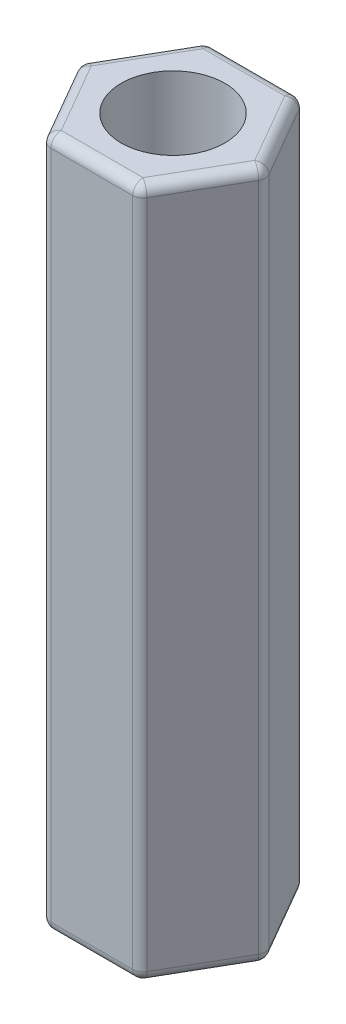
ISO-10303-21;
HEADER;
FILE_DESCRIPTION(('STEP AP214'),'2;1');
FILE_NAME('part.step','',(''),(''),'','','');
FILE_SCHEMA(('AUTOMOTIVE_DESIGN { 1 0 10303 214 1 1 1 1 }'));
ENDSEC;
DATA;
#1=APPLICATION_CONTEXT('core data for automotive mechanical design processes');
#2=APPLICATION_PROTOCOL_DEFINITION('international standard','automotive_design',2000,#1);
#3=PRODUCT_CONTEXT('',#1,'mechanical');
#4=PRODUCT('Part','Part','',(#3));
#5=PRODUCT_RELATED_PRODUCT_CATEGORY('part','',(#4));
#6=PRODUCT_DEFINITION_FORMATION('','',#4);
#7=PRODUCT_DEFINITION_CONTEXT('part definition',#1,'design');
#8=PRODUCT_DEFINITION('design','',#6,#7);
#9=PRODUCT_DEFINITION_SHAPE('','',#8);
#10=(LENGTH_UNIT() NAMED_UNIT(*) SI_UNIT(.MILLI.,.METRE.));
#11=(NAMED_UNIT(*) PLANE_ANGLE_UNIT() SI_UNIT($,.RADIAN.));
#12=(NAMED_UNIT(*) SI_UNIT($,.STERADIAN.) SOLID_ANGLE_UNIT());
#13=UNCERTAINTY_MEASURE_WITH_UNIT(LENGTH_MEASURE(1.E-05),#10,'distance_accuracy_value','');
#14=(GEOMETRIC_REPRESENTATION_CONTEXT(3) GLOBAL_UNCERTAINTY_ASSIGNED_CONTEXT((#13)) GLOBAL_UNIT_ASSIGNED_CONTEXT((#10,
#11,#12)) REPRESENTATION_CONTEXT('',''));
#15=CARTESIAN_POINT('',(0.,0.,0.));
#16=DIRECTION('',(0.,0.,1.));
#17=DIRECTION('',(1.,0.,0.));
#18=AXIS2_PLACEMENT_3D('',#15,#16,#17);
#19=CARTESIAN_POINT('',(0.,20.,0.));
#20=DIRECTION('',(0.,1.,0.));
#21=DIRECTION('',(0.,0.,1.));
#22=AXIS2_PLACEMENT_3D('',#19,#20,#21);
#23=PLANE('',#22);
#24=DIRECTION('',(0.500000000000007,0.,0.866025403784435));
#25=VECTOR('',#24,1.);
#26=CARTESIAN_POINT('',(-1.09696551146027,20.,2.20000000000001));
#27=LINE('',#26,#25);
#28=CARTESIAN_POINT('',(-2.36713610367747,20.,0.));
#29=VERTEX_POINT('',#28);
#30=CARTESIAN_POINT('',(-1.18356805183872,20.,2.05000000000001));
#31=VERTEX_POINT('',#30);
#32=EDGE_CURVE('E254',#29,#31,#27,.T.);
#33=ORIENTED_EDGE('',*,*,#32,.T.);
#34=DIRECTION('',(1.,0.,0.));
#35=VECTOR('',#34,1.);
#36=CARTESIAN_POINT('',(1.35677313259565,20.,2.04999999999999));
#37=LINE('',#36,#35);
#38=CARTESIAN_POINT('',(1.18356805183876,20.,2.04999999999999));
#39=VERTEX_POINT('',#38);
#40=EDGE_CURVE('E256',#31,#39,#37,.T.);
#41=ORIENTED_EDGE('',*,*,#40,.T.);
#42=DIRECTION('',(0.499999999999995,0.,-0.866025403784442));
#43=VECTOR('',#42,1.);
#44=CARTESIAN_POINT('',(2.45373864405591,20.,-0.149999999999998));
#45=LINE('',#44,#43);
#46=CARTESIAN_POINT('',(2.36713610367747,20.,0.));
#47=VERTEX_POINT('',#46);
#48=EDGE_CURVE('E246',#39,#47,#45,.T.);
#49=ORIENTED_EDGE('',*,*,#48,.T.);
#50=DIRECTION('',(-0.500000000000001,0.,-0.866025403784438));
#51=VECTOR('',#50,1.);
#52=CARTESIAN_POINT('',(1.09696551146029,20.,-2.20000000000001));
#53=LINE('',#52,#51);
#54=CARTESIAN_POINT('',(1.18356805183873,20.,-2.05000000000001));
#55=VERTEX_POINT('',#54);
#56=EDGE_CURVE('E248',#47,#55,#53,.T.);
#57=ORIENTED_EDGE('',*,*,#56,.T.);
#58=DIRECTION('',(-1.,0.,0.));
#59=VECTOR('',#58,1.);
#60=CARTESIAN_POINT('',(-1.35677313259563,20.,-2.05));
#61=LINE('',#60,#59);
#62=CARTESIAN_POINT('',(-1.18356805183874,20.,-2.05));
#63=VERTEX_POINT('',#62);
#64=EDGE_CURVE('E250',#55,#63,#61,.T.);
#65=ORIENTED_EDGE('',*,*,#64,.T.);
#66=DIRECTION('',(-0.499999999999995,0.,0.866025403784442));
#67=VECTOR('',#66,1.);
#68=CARTESIAN_POINT('',(-2.45373864405591,20.,0.150000000000017));
#69=LINE('',#68,#67);
#70=EDGE_CURVE('E252',#63,#29,#69,.T.);
#71=ORIENTED_EDGE('',*,*,#70,.T.);
#72=EDGE_LOOP('',(#33,#41,#49,#57,#65,#71));
#73=FACE_BOUND('',#72,.T.);
#74=CARTESIAN_POINT('',(0.,20.,0.));
#75=DIRECTION('',(0.,1.,0.));
#76=DIRECTION('',(0.,0.,1.));
#77=AXIS2_PLACEMENT_3D('',#74,#75,#76);
#78=CIRCLE('',#77,1.5);
#79=CARTESIAN_POINT('',(0.,20.,1.5));
#80=VERTEX_POINT('',#79);
#81=EDGE_CURVE('E193',#80,#80,#78,.T.);
#82=ORIENTED_EDGE('',*,*,#81,.F.);
#83=EDGE_LOOP('',(#82));
#84=FACE_BOUND('',#83,.T.);
#85=ADVANCED_FACE('F36',(#73,#84),#23,.T.);
#86=CARTESIAN_POINT('',(0.,0.,0.));
#87=DIRECTION('',(0.,1.,0.));
#88=DIRECTION('',(0.,0.,1.));
#89=AXIS2_PLACEMENT_3D('',#86,#87,#88);
#90=PLANE('',#89);
#91=DIRECTION('',(0.499999999999995,0.,-0.866025403784442));
#92=VECTOR('',#91,1.);
#93=CARTESIAN_POINT('',(1.77535207775811,0.,1.02499999999999));
#94=LINE('',#93,#92);
#95=CARTESIAN_POINT('',(2.36713610367747,0.,0.));
#96=VERTEX_POINT('',#95);
#97=CARTESIAN_POINT('',(1.18356805183876,0.,2.04999999999999));
#98=VERTEX_POINT('',#97);
#99=EDGE_CURVE('E259',#96,#98,#94,.F.);
#100=ORIENTED_EDGE('',*,*,#99,.T.);
#101=DIRECTION('',(1.,0.,0.));
#102=VECTOR('',#101,1.);
#103=CARTESIAN_POINT('',(0.,0.,2.05));
#104=LINE('',#103,#102);
#105=CARTESIAN_POINT('',(-1.18356805183871,0.,2.05000000000001));
#106=VERTEX_POINT('',#105);
#107=EDGE_CURVE('E11',#98,#106,#104,.F.);
#108=ORIENTED_EDGE('',*,*,#107,.T.);
#109=DIRECTION('',(0.500000000000007,0.,0.866025403784435));
#110=VECTOR('',#109,1.);
#111=CARTESIAN_POINT('',(-1.77535207775809,0.,1.02500000000001));
#112=LINE('',#111,#110);
#113=CARTESIAN_POINT('',(-2.36713610367747,0.,0.));
#114=VERTEX_POINT('',#113);
#115=EDGE_CURVE('E45',#106,#114,#112,.F.);
#116=ORIENTED_EDGE('',*,*,#115,.T.);
#117=DIRECTION('',(-0.499999999999995,0.,0.866025403784442));
#118=VECTOR('',#117,1.);
#119=CARTESIAN_POINT('',(-1.77535207775811,0.,-1.02499999999999));
#120=LINE('',#119,#118);
#121=CARTESIAN_POINT('',(-1.18356805183874,0.,-2.05));
#122=VERTEX_POINT('',#121);
#123=EDGE_CURVE('E265',#114,#122,#120,.F.);
#124=ORIENTED_EDGE('',*,*,#123,.T.);
#125=DIRECTION('',(-1.,0.,0.));
#126=VECTOR('',#125,1.);
#127=CARTESIAN_POINT('',(0.,0.,-2.05));
#128=LINE('',#127,#126);
#129=CARTESIAN_POINT('',(1.18356805183873,0.,-2.05000000000001));
#130=VERTEX_POINT('',#129);
#131=EDGE_CURVE('E263',#122,#130,#128,.F.);
#132=ORIENTED_EDGE('',*,*,#131,.T.);
#133=DIRECTION('',(-0.500000000000001,0.,-0.866025403784438));
#134=VECTOR('',#133,1.);
#135=CARTESIAN_POINT('',(1.7753520777581,0.,-1.025));
#136=LINE('',#135,#134);
#137=EDGE_CURVE('E261',#130,#96,#136,.F.);
#138=ORIENTED_EDGE('',*,*,#137,.T.);
#139=EDGE_LOOP('',(#100,#108,#116,#124,#132,#138));
#140=FACE_BOUND('',#139,.T.);
#141=CARTESIAN_POINT('',(0.,0.,0.));
#142=DIRECTION('',(0.,1.,0.));
#143=DIRECTION('',(0.,0.,1.));
#144=AXIS2_PLACEMENT_3D('',#141,#142,#143);
#145=CIRCLE('',#144,1.5);
#146=CARTESIAN_POINT('',(0.,0.,1.5));
#147=VERTEX_POINT('',#146);
#148=EDGE_CURVE('E357',#147,#147,#145,.T.);
#149=ORIENTED_EDGE('',*,*,#148,.T.);
#150=EDGE_LOOP('',(#149));
#151=FACE_BOUND('',#150,.T.);
#152=ADVANCED_FACE('F374',(#140,#151),#90,.F.);
#153=CARTESIAN_POINT('',(1.35677313259565,20.,2.34999999999999));
#154=DIRECTION('',(-0.866025403784442,0.,-0.499999999999995));
#155=DIRECTION('',(-0.499999999999995,0.,0.866025403784442));
#156=AXIS2_PLACEMENT_3D('',#153,#154,#155);
#157=PLANE('',#156);
#158=DIRECTION('',(0.,-1.,0.));
#159=VECTOR('',#158,1.);
#160=CARTESIAN_POINT('',(2.6269437248128,20.,0.15));
#161=LINE('',#160,#159);
#162=CARTESIAN_POINT('',(2.6269437248128,0.300000000000002,0.15));
#163=VERTEX_POINT('',#162);
#164=CARTESIAN_POINT('',(2.6269437248128,19.7,0.15));
#165=VERTEX_POINT('',#164);
#166=EDGE_CURVE('E170',#163,#165,#161,.F.);
#167=ORIENTED_EDGE('',*,*,#166,.T.);
#168=DIRECTION('',(0.499999999999995,0.,-0.866025403784442));
#169=VECTOR('',#168,1.);
#170=CARTESIAN_POINT('',(1.35677313259565,19.7,2.34999999999999));
#171=LINE('',#170,#169);
#172=CARTESIAN_POINT('',(1.44337567297409,19.7,2.19999999999999));
#173=VERTEX_POINT('',#172);
#174=EDGE_CURVE('E208',#165,#173,#171,.F.);
#175=ORIENTED_EDGE('',*,*,#174,.T.);
#176=DIRECTION('',(0.,-1.,0.));
#177=VECTOR('',#176,1.);
#178=CARTESIAN_POINT('',(1.44337567297409,20.,2.19999999999999));
#179=LINE('',#178,#177);
#180=CARTESIAN_POINT('',(1.44337567297409,0.300000000000002,2.19999999999999));
#181=VERTEX_POINT('',#180);
#182=EDGE_CURVE('E205',#173,#181,#179,.T.);
#183=ORIENTED_EDGE('',*,*,#182,.T.);
#184=DIRECTION('',(0.499999999999995,0.,-0.866025403784442));
#185=VECTOR('',#184,1.);
#186=CARTESIAN_POINT('',(1.35677313259565,0.300000000000002,2.34999999999999));
#187=LINE('',#186,#185);
#188=EDGE_CURVE('E200',#181,#163,#187,.T.);
#189=ORIENTED_EDGE('',*,*,#188,.T.);
#190=EDGE_LOOP('',(#167,#175,#183,#189));
#191=FACE_BOUND('',#190,.T.);
#192=ADVANCED_FACE('F380',(#191),#157,.F.);
#193=CARTESIAN_POINT('',(2.71354626519124,20.,0.));
#194=DIRECTION('',(-0.866025403784438,0.,0.500000000000001));
#195=DIRECTION('',(0.500000000000001,0.,0.866025403784438));
#196=AXIS2_PLACEMENT_3D('',#193,#194,#195);
#197=PLANE('',#196);
#198=DIRECTION('',(0.,-1.,0.));
#199=VECTOR('',#198,1.);
#200=CARTESIAN_POINT('',(1.44337567297406,20.,-2.20000000000001));
#201=LINE('',#200,#199);
#202=CARTESIAN_POINT('',(1.44337567297406,0.300000000000002,-2.20000000000001));
#203=VERTEX_POINT('',#202);
#204=CARTESIAN_POINT('',(1.44337567297406,19.7,-2.20000000000001));
#205=VERTEX_POINT('',#204);
#206=EDGE_CURVE('E192',#203,#205,#201,.F.);
#207=ORIENTED_EDGE('',*,*,#206,.T.);
#208=DIRECTION('',(-0.500000000000001,0.,-0.866025403784438));
#209=VECTOR('',#208,1.);
#210=CARTESIAN_POINT('',(2.71354626519124,19.7,0.));
#211=LINE('',#210,#209);
#212=CARTESIAN_POINT('',(2.6269437248128,19.7,-0.149999999999999));
#213=VERTEX_POINT('',#212);
#214=EDGE_CURVE('E197',#205,#213,#211,.F.);
#215=ORIENTED_EDGE('',*,*,#214,.T.);
#216=DIRECTION('',(0.,-1.,0.));
#217=VECTOR('',#216,1.);
#218=CARTESIAN_POINT('',(2.6269437248128,20.,-0.149999999999999));
#219=LINE('',#218,#217);
#220=CARTESIAN_POINT('',(2.6269437248128,0.300000000000002,-0.149999999999999));
#221=VERTEX_POINT('',#220);
#222=EDGE_CURVE('E168',#213,#221,#219,.T.);
#223=ORIENTED_EDGE('',*,*,#222,.T.);
#224=DIRECTION('',(-0.500000000000001,0.,-0.866025403784438));
#225=VECTOR('',#224,1.);
#226=CARTESIAN_POINT('',(2.71354626519124,0.300000000000002,0.));
#227=LINE('',#226,#225);
#228=EDGE_CURVE('E186',#221,#203,#227,.T.);
#229=ORIENTED_EDGE('',*,*,#228,.T.);
#230=EDGE_LOOP('',(#207,#215,#223,#229));
#231=FACE_BOUND('',#230,.T.);
#232=ADVANCED_FACE('F195',(#231),#197,.F.);
#233=CARTESIAN_POINT('',(1.35677313259562,20.,-2.35000000000001));
#234=DIRECTION('',(0.,0.,1.));
#235=DIRECTION('',(1.,0.,0.));
#236=AXIS2_PLACEMENT_3D('',#233,#234,#235);
#237=PLANE('',#236);
#238=DIRECTION('',(0.,-1.,0.));
#239=VECTOR('',#238,1.);
#240=CARTESIAN_POINT('',(-1.18356805183874,20.,-2.35));
#241=LINE('',#240,#239);
#242=CARTESIAN_POINT('',(-1.18356805183874,0.300000000000002,-2.35));
#243=VERTEX_POINT('',#242);
#244=CARTESIAN_POINT('',(-1.18356805183874,19.7,-2.35));
#245=VERTEX_POINT('',#244);
#246=EDGE_CURVE('E212',#243,#245,#241,.F.);
#247=ORIENTED_EDGE('',*,*,#246,.T.);
#248=DIRECTION('',(-1.,0.,0.));
#249=VECTOR('',#248,1.);
#250=CARTESIAN_POINT('',(1.35677313259562,19.7,-2.35000000000001));
#251=LINE('',#250,#249);
#252=CARTESIAN_POINT('',(1.18356805183873,19.7,-2.35));
#253=VERTEX_POINT('',#252);
#254=EDGE_CURVE('E217',#245,#253,#251,.F.);
#255=ORIENTED_EDGE('',*,*,#254,.T.);
#256=DIRECTION('',(0.,-1.,0.));
#257=VECTOR('',#256,1.);
#258=CARTESIAN_POINT('',(1.18356805183873,20.,-2.35));
#259=LINE('',#258,#257);
#260=CARTESIAN_POINT('',(1.18356805183873,0.300000000000002,-2.35));
#261=VERTEX_POINT('',#260);
#262=EDGE_CURVE('E214',#253,#261,#259,.T.);
#263=ORIENTED_EDGE('',*,*,#262,.T.);
#264=DIRECTION('',(-1.,0.,0.));
#265=VECTOR('',#264,1.);
#266=CARTESIAN_POINT('',(1.35677313259562,0.300000000000002,-2.35000000000001));
#267=LINE('',#266,#265);
#268=EDGE_CURVE('E210',#261,#243,#267,.T.);
#269=ORIENTED_EDGE('',*,*,#268,.T.);
#270=EDGE_LOOP('',(#247,#255,#263,#269));
#271=FACE_BOUND('',#270,.T.);
#272=ADVANCED_FACE('F395',(#271),#237,.F.);
#273=CARTESIAN_POINT('',(-1.35677313259563,20.,-2.35));
#274=DIRECTION('',(0.866025403784442,0.,0.499999999999995));
#275=DIRECTION('',(0.499999999999995,0.,-0.866025403784442));
#276=AXIS2_PLACEMENT_3D('',#273,#274,#275);
#277=PLANE('',#276);
#278=DIRECTION('',(0.,-1.,0.));
#279=VECTOR('',#278,1.);
#280=CARTESIAN_POINT('',(-2.6269437248128,20.,-0.149999999999982));
#281=LINE('',#280,#279);
#282=CARTESIAN_POINT('',(-2.6269437248128,0.300000000000002,-0.149999999999982));
#283=VERTEX_POINT('',#282);
#284=CARTESIAN_POINT('',(-2.6269437248128,19.7,-0.149999999999982));
#285=VERTEX_POINT('',#284);
#286=EDGE_CURVE('E221',#283,#285,#281,.F.);
#287=ORIENTED_EDGE('',*,*,#286,.T.);
#288=DIRECTION('',(-0.499999999999995,0.,0.866025403784442));
#289=VECTOR('',#288,1.);
#290=CARTESIAN_POINT('',(-1.35677313259563,19.7,-2.35));
#291=LINE('',#290,#289);
#292=CARTESIAN_POINT('',(-1.44337567297408,19.7,-2.19999999999999));
#293=VERTEX_POINT('',#292);
#294=EDGE_CURVE('E226',#285,#293,#291,.F.);
#295=ORIENTED_EDGE('',*,*,#294,.T.);
#296=DIRECTION('',(0.,-1.,0.));
#297=VECTOR('',#296,1.);
#298=CARTESIAN_POINT('',(-1.44337567297408,20.,-2.19999999999999));
#299=LINE('',#298,#297);
#300=CARTESIAN_POINT('',(-1.44337567297408,0.300000000000002,-2.19999999999999));
#301=VERTEX_POINT('',#300);
#302=EDGE_CURVE('E223',#293,#301,#299,.T.);
#303=ORIENTED_EDGE('',*,*,#302,.T.);
#304=DIRECTION('',(-0.499999999999995,0.,0.866025403784442));
#305=VECTOR('',#304,1.);
#306=CARTESIAN_POINT('',(-1.35677313259563,0.300000000000002,-2.35));
#307=LINE('',#306,#305);
#308=EDGE_CURVE('E219',#301,#283,#307,.T.);
#309=ORIENTED_EDGE('',*,*,#308,.T.);
#310=EDGE_LOOP('',(#287,#295,#303,#309));
#311=FACE_BOUND('',#310,.T.);
#312=ADVANCED_FACE('F391',(#311),#277,.F.);
#313=CARTESIAN_POINT('',(-2.71354626519124,20.,0.));
#314=DIRECTION('',(0.866025403784434,0.,-0.500000000000007));
#315=DIRECTION('',(-0.500000000000007,0.,-0.866025403784435));
#316=AXIS2_PLACEMENT_3D('',#313,#314,#315);
#317=PLANE('',#316);
#318=DIRECTION('',(0.,-1.,0.));
#319=VECTOR('',#318,1.);
#320=CARTESIAN_POINT('',(-1.44337567297405,20.,2.20000000000001));
#321=LINE('',#320,#319);
#322=CARTESIAN_POINT('',(-1.44337567297405,0.300000000000002,2.20000000000001));
#323=VERTEX_POINT('',#322);
#324=CARTESIAN_POINT('',(-1.44337567297405,19.7,2.20000000000001));
#325=VERTEX_POINT('',#324);
#326=EDGE_CURVE('E230',#323,#325,#321,.F.);
#327=ORIENTED_EDGE('',*,*,#326,.T.);
#328=DIRECTION('',(0.500000000000007,0.,0.866025403784435));
#329=VECTOR('',#328,1.);
#330=CARTESIAN_POINT('',(-2.71354626519124,19.7,0.));
#331=LINE('',#330,#329);
#332=CARTESIAN_POINT('',(-2.6269437248128,19.7,0.150000000000019));
#333=VERTEX_POINT('',#332);
#334=EDGE_CURVE('E235',#325,#333,#331,.F.);
#335=ORIENTED_EDGE('',*,*,#334,.T.);
#336=DIRECTION('',(0.,-1.,0.));
#337=VECTOR('',#336,1.);
#338=CARTESIAN_POINT('',(-2.6269437248128,20.,0.150000000000019));
#339=LINE('',#338,#337);
#340=CARTESIAN_POINT('',(-2.6269437248128,0.300000000000002,0.150000000000019));
#341=VERTEX_POINT('',#340);
#342=EDGE_CURVE('E232',#333,#341,#339,.T.);
#343=ORIENTED_EDGE('',*,*,#342,.T.);
#344=DIRECTION('',(0.500000000000007,0.,0.866025403784435));
#345=VECTOR('',#344,1.);
#346=CARTESIAN_POINT('',(-2.71354626519124,0.300000000000002,0.));
#347=LINE('',#346,#345);
#348=EDGE_CURVE('E228',#341,#323,#347,.T.);
#349=ORIENTED_EDGE('',*,*,#348,.T.);
#350=EDGE_LOOP('',(#327,#335,#343,#349));
#351=FACE_BOUND('',#350,.T.);
#352=ADVANCED_FACE('F387',(#351),#317,.F.);
#353=CARTESIAN_POINT('',(-1.3567731325956,20.,2.35000000000001));
#354=DIRECTION('',(0.,0.,-1.));
#355=DIRECTION('',(-1.,0.,0.));
#356=AXIS2_PLACEMENT_3D('',#353,#354,#355);
#357=PLANE('',#356);
#358=DIRECTION('',(0.,-1.,0.));
#359=VECTOR('',#358,1.);
#360=CARTESIAN_POINT('',(1.18356805183876,20.,2.34999999999999));
#361=LINE('',#360,#359);
#362=CARTESIAN_POINT('',(1.18356805183876,0.300000000000002,2.34999999999999));
#363=VERTEX_POINT('',#362);
#364=CARTESIAN_POINT('',(1.18356805183876,19.7,2.34999999999999));
#365=VERTEX_POINT('',#364);
#366=EDGE_CURVE('E239',#363,#365,#361,.F.);
#367=ORIENTED_EDGE('',*,*,#366,.T.);
#368=DIRECTION('',(1.,0.,0.));
#369=VECTOR('',#368,1.);
#370=CARTESIAN_POINT('',(-1.3567731325956,19.7,2.35000000000001));
#371=LINE('',#370,#369);
#372=CARTESIAN_POINT('',(-1.18356805183871,19.7,2.35000000000001));
#373=VERTEX_POINT('',#372);
#374=EDGE_CURVE('E244',#365,#373,#371,.F.);
#375=ORIENTED_EDGE('',*,*,#374,.T.);
#376=DIRECTION('',(0.,-1.,0.));
#377=VECTOR('',#376,1.);
#378=CARTESIAN_POINT('',(-1.18356805183871,20.,2.35000000000001));
#379=LINE('',#378,#377);
#380=CARTESIAN_POINT('',(-1.18356805183871,0.300000000000002,2.35000000000001));
#381=VERTEX_POINT('',#380);
#382=EDGE_CURVE('E241',#373,#381,#379,.T.);
#383=ORIENTED_EDGE('',*,*,#382,.T.);
#384=DIRECTION('',(1.,0.,0.));
#385=VECTOR('',#384,1.);
#386=CARTESIAN_POINT('',(-1.3567731325956,0.300000000000002,2.35000000000001));
#387=LINE('',#386,#385);
#388=EDGE_CURVE('E237',#381,#363,#387,.T.);
#389=ORIENTED_EDGE('',*,*,#388,.T.);
#390=EDGE_LOOP('',(#367,#375,#383,#389));
#391=FACE_BOUND('',#390,.T.);
#392=ADVANCED_FACE('F384',(#391),#357,.F.);
#393=CARTESIAN_POINT('',(0.,20.,0.));
#394=DIRECTION('',(0.,-1.,0.));
#395=DIRECTION('',(0.,0.,-1.));
#396=AXIS2_PLACEMENT_3D('',#393,#394,#395);
#397=CYLINDRICAL_SURFACE('',#396,1.5);
#398=ORIENTED_EDGE('',*,*,#81,.T.);
#399=EDGE_LOOP('',(#398));
#400=FACE_BOUND('',#399,.T.);
#401=ORIENTED_EDGE('',*,*,#148,.F.);
#402=EDGE_LOOP('',(#401));
#403=FACE_BOUND('',#402,.T.);
#404=ADVANCED_FACE('F370',(#400,#403),#397,.F.);
#405=CARTESIAN_POINT('',(-2.36713610367747,20.,0.));
#406=DIRECTION('',(0.,-1.,0.));
#407=DIRECTION('',(0.,0.,-1.));
#408=AXIS2_PLACEMENT_3D('',#405,#406,#407);
#409=CYLINDRICAL_SURFACE('',#408,0.3);
#410=CARTESIAN_POINT('',(-2.36713610367747,19.7,0.));
#411=DIRECTION('',(0.,1.,0.));
#412=DIRECTION('',(0.,0.,1.));
#413=AXIS2_PLACEMENT_3D('',#410,#411,#412);
#414=CIRCLE('',#413,0.3);
#415=EDGE_CURVE('E40',#285,#333,#414,.T.);
#416=ORIENTED_EDGE('',*,*,#415,.F.);
#417=ORIENTED_EDGE('',*,*,#286,.F.);
#418=CARTESIAN_POINT('',(-2.36713610367747,0.300000000000002,0.));
#419=DIRECTION('',(0.,-1.,0.));
#420=DIRECTION('',(0.,0.,-1.));
#421=AXIS2_PLACEMENT_3D('',#418,#419,#420);
#422=CIRCLE('',#421,0.3);
#423=EDGE_CURVE('E350',#341,#283,#422,.T.);
#424=ORIENTED_EDGE('',*,*,#423,.F.);
#425=ORIENTED_EDGE('',*,*,#342,.F.);
#426=EDGE_LOOP('',(#416,#417,#424,#425));
#427=FACE_BOUND('',#426,.T.);
#428=ADVANCED_FACE('F38',(#427),#409,.T.);
#429=CARTESIAN_POINT('',(-2.36713610367747,19.7,0.));
#430=DIRECTION('',(0.,0.,1.));
#431=DIRECTION('',(1.,0.,0.));
#432=AXIS2_PLACEMENT_3D('',#429,#430,#431);
#433=SPHERICAL_SURFACE('',#432,0.3);
#434=CARTESIAN_POINT('',(-2.36713610367747,19.7,0.));
#435=DIRECTION('',(-0.499999999999995,0.,0.866025403784442));
#436=DIRECTION('',(0.866025403784442,0.,0.499999999999995));
#437=AXIS2_PLACEMENT_3D('',#434,#435,#436);
#438=CIRCLE('',#437,0.3);
#439=EDGE_CURVE('E345',#285,#29,#438,.F.);
#440=ORIENTED_EDGE('',*,*,#439,.F.);
#441=ORIENTED_EDGE('',*,*,#415,.T.);
#442=CARTESIAN_POINT('',(-2.36713610367747,19.7,0.));
#443=DIRECTION('',(-0.500000000000007,0.,-0.866025403784435));
#444=DIRECTION('',(-0.866025403784435,0.,0.500000000000007));
#445=AXIS2_PLACEMENT_3D('',#442,#443,#444);
#446=CIRCLE('',#445,0.3);
#447=EDGE_CURVE('E348',#29,#333,#446,.F.);
#448=ORIENTED_EDGE('',*,*,#447,.F.);
#449=EDGE_LOOP('',(#440,#441,#448));
#450=FACE_BOUND('',#449,.T.);
#451=ADVANCED_FACE('F508',(#450),#433,.T.);
#452=CARTESIAN_POINT('',(-2.36713610367747,0.3,0.));
#453=DIRECTION('',(0.,0.,1.));
#454=DIRECTION('',(1.,0.,0.));
#455=AXIS2_PLACEMENT_3D('',#452,#453,#454);
#456=SPHERICAL_SURFACE('',#455,0.3);
#457=CARTESIAN_POINT('',(-2.36713610367747,0.3,0.));
#458=DIRECTION('',(-0.500000000000006,0.,-0.866025403784435));
#459=DIRECTION('',(-0.866025403784435,0.,0.500000000000006));
#460=AXIS2_PLACEMENT_3D('',#457,#458,#459);
#461=CIRCLE('',#460,0.3);
#462=EDGE_CURVE('E340',#341,#114,#461,.F.);
#463=ORIENTED_EDGE('',*,*,#462,.F.);
#464=ORIENTED_EDGE('',*,*,#423,.T.);
#465=CARTESIAN_POINT('',(-2.36713610367747,0.300000000000002,0.));
#466=DIRECTION('',(-0.499999999999995,0.,0.866025403784442));
#467=DIRECTION('',(0.866025403784442,0.,0.499999999999995));
#468=AXIS2_PLACEMENT_3D('',#465,#466,#467);
#469=CIRCLE('',#468,0.3);
#470=EDGE_CURVE('E342',#114,#283,#469,.F.);
#471=ORIENTED_EDGE('',*,*,#470,.F.);
#472=EDGE_LOOP('',(#463,#464,#471));
#473=FACE_BOUND('',#472,.T.);
#474=ADVANCED_FACE('F505',(#473),#456,.T.);
#475=CARTESIAN_POINT('',(-1.77535207775809,19.7,1.02500000000001));
#476=DIRECTION('',(-0.500000000000007,0.,-0.866025403784435));
#477=DIRECTION('',(-0.866025403784434,0.,0.500000000000007));
#478=AXIS2_PLACEMENT_3D('',#475,#476,#477);
#479=CYLINDRICAL_SURFACE('',#478,0.3);
#480=ORIENTED_EDGE('',*,*,#447,.T.);
#481=ORIENTED_EDGE('',*,*,#334,.F.);
#482=CARTESIAN_POINT('',(-1.18356805183872,19.7,2.05000000000001));
#483=DIRECTION('',(0.500000000000008,0.,0.866025403784434));
#484=DIRECTION('',(0.866025403784434,0.,-0.500000000000008));
#485=AXIS2_PLACEMENT_3D('',#482,#483,#484);
#486=CIRCLE('',#485,0.3);
#487=EDGE_CURVE('E334',#31,#325,#486,.T.);
#488=ORIENTED_EDGE('',*,*,#487,.F.);
#489=ORIENTED_EDGE('',*,*,#32,.F.);
#490=EDGE_LOOP('',(#480,#481,#488,#489));
#491=FACE_BOUND('',#490,.T.);
#492=ADVANCED_FACE('F501',(#491),#479,.T.);
#493=CARTESIAN_POINT('',(-1.77535207775811,19.7,-1.02499999999999));
#494=DIRECTION('',(0.499999999999995,0.,-0.866025403784442));
#495=DIRECTION('',(-0.866025403784442,0.,-0.499999999999995));
#496=AXIS2_PLACEMENT_3D('',#493,#494,#495);
#497=CYLINDRICAL_SURFACE('',#496,0.3);
#498=ORIENTED_EDGE('',*,*,#439,.T.);
#499=ORIENTED_EDGE('',*,*,#70,.F.);
#500=CARTESIAN_POINT('',(-1.18356805183874,19.7,-2.05));
#501=DIRECTION('',(0.499999999999996,0.,-0.866025403784441));
#502=DIRECTION('',(-0.866025403784441,0.,-0.499999999999996));
#503=AXIS2_PLACEMENT_3D('',#500,#501,#502);
#504=CIRCLE('',#503,0.3);
#505=EDGE_CURVE('E331',#293,#63,#504,.T.);
#506=ORIENTED_EDGE('',*,*,#505,.F.);
#507=ORIENTED_EDGE('',*,*,#294,.F.);
#508=EDGE_LOOP('',(#498,#499,#506,#507));
#509=FACE_BOUND('',#508,.T.);
#510=ADVANCED_FACE('F497',(#509),#497,.T.);
#511=CARTESIAN_POINT('',(-1.18356805183874,20.,-2.05));
#512=DIRECTION('',(0.,-1.,0.));
#513=DIRECTION('',(0.,0.,-1.));
#514=AXIS2_PLACEMENT_3D('',#511,#512,#513);
#515=CYLINDRICAL_SURFACE('',#514,0.3);
#516=CARTESIAN_POINT('',(-1.18356805183874,0.300000000000002,-2.05));
#517=DIRECTION('',(0.,-1.,0.));
#518=DIRECTION('',(0.,0.,-1.));
#519=AXIS2_PLACEMENT_3D('',#516,#517,#518);
#520=CIRCLE('',#519,0.3);
#521=EDGE_CURVE('E325',#301,#243,#520,.T.);
#522=ORIENTED_EDGE('',*,*,#521,.F.);
#523=ORIENTED_EDGE('',*,*,#302,.F.);
#524=CARTESIAN_POINT('',(-1.18356805183874,19.7,-2.05));
#525=DIRECTION('',(0.,1.,0.));
#526=DIRECTION('',(0.,0.,1.));
#527=AXIS2_PLACEMENT_3D('',#524,#525,#526);
#528=CIRCLE('',#527,0.3);
#529=EDGE_CURVE('E328',#245,#293,#528,.T.);
#530=ORIENTED_EDGE('',*,*,#529,.F.);
#531=ORIENTED_EDGE('',*,*,#246,.F.);
#532=EDGE_LOOP('',(#522,#523,#530,#531));
#533=FACE_BOUND('',#532,.T.);
#534=ADVANCED_FACE('F493',(#533),#515,.T.);
#535=CARTESIAN_POINT('',(-1.0969655114603,0.300000000000002,-2.2));
#536=DIRECTION('',(-0.499999999999995,0.,0.866025403784442));
#537=DIRECTION('',(0.866025403784442,0.,0.499999999999995));
#538=AXIS2_PLACEMENT_3D('',#535,#536,#537);
#539=CYLINDRICAL_SURFACE('',#538,0.3);
#540=ORIENTED_EDGE('',*,*,#470,.T.);
#541=ORIENTED_EDGE('',*,*,#308,.F.);
#542=CARTESIAN_POINT('',(-1.18356805183874,0.3,-2.05));
#543=DIRECTION('',(0.499999999999995,0.,-0.866025403784441));
#544=DIRECTION('',(-0.866025403784441,0.,-0.499999999999995));
#545=AXIS2_PLACEMENT_3D('',#542,#543,#544);
#546=CIRCLE('',#545,0.3);
#547=EDGE_CURVE('E323',#122,#301,#546,.T.);
#548=ORIENTED_EDGE('',*,*,#547,.F.);
#549=ORIENTED_EDGE('',*,*,#123,.F.);
#550=EDGE_LOOP('',(#540,#541,#548,#549));
#551=FACE_BOUND('',#550,.T.);
#552=ADVANCED_FACE('F489',(#551),#539,.T.);
#553=CARTESIAN_POINT('',(-2.45373864405591,0.300000000000002,-0.149999999999983));
#554=DIRECTION('',(0.500000000000007,0.,0.866025403784435));
#555=DIRECTION('',(0.866025403784434,0.,-0.500000000000007));
#556=AXIS2_PLACEMENT_3D('',#553,#554,#555);
#557=CYLINDRICAL_SURFACE('',#556,0.3);
#558=ORIENTED_EDGE('',*,*,#462,.T.);
#559=ORIENTED_EDGE('',*,*,#115,.F.);
#560=CARTESIAN_POINT('',(-1.18356805183871,0.300000000000002,2.05000000000001));
#561=DIRECTION('',(0.500000000000007,0.,0.866025403784435));
#562=DIRECTION('',(0.866025403784435,0.,-0.500000000000007));
#563=AXIS2_PLACEMENT_3D('',#560,#561,#562);
#564=CIRCLE('',#563,0.3);
#565=EDGE_CURVE('E321',#323,#106,#564,.T.);
#566=ORIENTED_EDGE('',*,*,#565,.F.);
#567=ORIENTED_EDGE('',*,*,#348,.F.);
#568=EDGE_LOOP('',(#558,#559,#566,#567));
#569=FACE_BOUND('',#568,.T.);
#570=ADVANCED_FACE('F485',(#569),#557,.T.);
#571=CARTESIAN_POINT('',(-1.18356805183871,20.,2.05000000000001));
#572=DIRECTION('',(0.,-1.,0.));
#573=DIRECTION('',(0.,0.,-1.));
#574=AXIS2_PLACEMENT_3D('',#571,#572,#573);
#575=CYLINDRICAL_SURFACE('',#574,0.3);
#576=CARTESIAN_POINT('',(-1.18356805183871,19.7,2.05000000000001));
#577=DIRECTION('',(0.,1.,0.));
#578=DIRECTION('',(0.,0.,1.));
#579=AXIS2_PLACEMENT_3D('',#576,#577,#578);
#580=CIRCLE('',#579,0.3);
#581=EDGE_CURVE('E337',#325,#373,#580,.T.);
#582=ORIENTED_EDGE('',*,*,#581,.F.);
#583=ORIENTED_EDGE('',*,*,#326,.F.);
#584=CARTESIAN_POINT('',(-1.18356805183871,0.300000000000002,2.05000000000001));
#585=DIRECTION('',(0.,-1.,0.));
#586=DIRECTION('',(0.,0.,-1.));
#587=AXIS2_PLACEMENT_3D('',#584,#585,#586);
#588=CIRCLE('',#587,0.3);
#589=EDGE_CURVE('E318',#381,#323,#588,.T.);
#590=ORIENTED_EDGE('',*,*,#589,.F.);
#591=ORIENTED_EDGE('',*,*,#382,.F.);
#592=EDGE_LOOP('',(#582,#583,#590,#591));
#593=FACE_BOUND('',#592,.T.);
#594=ADVANCED_FACE('F481',(#593),#575,.T.);
#595=CARTESIAN_POINT('',(-1.18356805183871,19.7,2.05000000000001));
#596=DIRECTION('',(0.,0.,1.));
#597=DIRECTION('',(1.,0.,0.));
#598=AXIS2_PLACEMENT_3D('',#595,#596,#597);
#599=SPHERICAL_SURFACE('',#598,0.3);
#600=ORIENTED_EDGE('',*,*,#487,.T.);
#601=ORIENTED_EDGE('',*,*,#581,.T.);
#602=CARTESIAN_POINT('',(-1.18356805183871,19.7,2.05000000000001));
#603=DIRECTION('',(-1.,0.,0.));
#604=DIRECTION('',(0.,0.,1.));
#605=AXIS2_PLACEMENT_3D('',#602,#603,#604);
#606=CIRCLE('',#605,0.3);
#607=EDGE_CURVE('E315',#31,#373,#606,.F.);
#608=ORIENTED_EDGE('',*,*,#607,.F.);
#609=EDGE_LOOP('',(#600,#601,#608));
#610=FACE_BOUND('',#609,.T.);
#611=ADVANCED_FACE('F477',(#610),#599,.T.);
#612=CARTESIAN_POINT('',(-1.18356805183874,19.7,-2.05));
#613=DIRECTION('',(0.,0.,1.));
#614=DIRECTION('',(1.,0.,0.));
#615=AXIS2_PLACEMENT_3D('',#612,#613,#614);
#616=SPHERICAL_SURFACE('',#615,0.3);
#617=ORIENTED_EDGE('',*,*,#529,.T.);
#618=ORIENTED_EDGE('',*,*,#505,.T.);
#619=CARTESIAN_POINT('',(-1.18356805183874,19.7,-2.05));
#620=DIRECTION('',(-1.,0.,0.));
#621=DIRECTION('',(0.,0.,1.));
#622=AXIS2_PLACEMENT_3D('',#619,#620,#621);
#623=CIRCLE('',#622,0.3);
#624=EDGE_CURVE('E312',#245,#63,#623,.F.);
#625=ORIENTED_EDGE('',*,*,#624,.F.);
#626=EDGE_LOOP('',(#617,#618,#625));
#627=FACE_BOUND('',#626,.T.);
#628=ADVANCED_FACE('F473',(#627),#616,.T.);
#629=CARTESIAN_POINT('',(-1.18356805183874,0.3,-2.05));
#630=DIRECTION('',(0.,0.,1.));
#631=DIRECTION('',(1.,0.,0.));
#632=AXIS2_PLACEMENT_3D('',#629,#630,#631);
#633=SPHERICAL_SURFACE('',#632,0.3);
#634=ORIENTED_EDGE('',*,*,#547,.T.);
#635=ORIENTED_EDGE('',*,*,#521,.T.);
#636=CARTESIAN_POINT('',(-1.18356805183874,0.300000000000002,-2.05));
#637=DIRECTION('',(-1.,0.,0.));
#638=DIRECTION('',(0.,0.,1.));
#639=AXIS2_PLACEMENT_3D('',#636,#637,#638);
#640=CIRCLE('',#639,0.3);
#641=EDGE_CURVE('E309',#122,#243,#640,.F.);
#642=ORIENTED_EDGE('',*,*,#641,.F.);
#643=EDGE_LOOP('',(#634,#635,#642));
#644=FACE_BOUND('',#643,.T.);
#645=ADVANCED_FACE('F469',(#644),#633,.T.);
#646=CARTESIAN_POINT('',(-1.18356805183871,0.3,2.05000000000001));
#647=DIRECTION('',(0.,0.,1.));
#648=DIRECTION('',(1.,0.,0.));
#649=AXIS2_PLACEMENT_3D('',#646,#647,#648);
#650=SPHERICAL_SURFACE('',#649,0.3);
#651=ORIENTED_EDGE('',*,*,#589,.T.);
#652=ORIENTED_EDGE('',*,*,#565,.T.);
#653=CARTESIAN_POINT('',(-1.18356805183871,0.3,2.05000000000001));
#654=DIRECTION('',(-1.,0.,0.));
#655=DIRECTION('',(0.,0.,1.));
#656=AXIS2_PLACEMENT_3D('',#653,#654,#655);
#657=CIRCLE('',#656,0.3);
#658=EDGE_CURVE('E53',#381,#106,#657,.F.);
#659=ORIENTED_EDGE('',*,*,#658,.F.);
#660=EDGE_LOOP('',(#651,#652,#659));
#661=FACE_BOUND('',#660,.T.);
#662=ADVANCED_FACE('F465',(#661),#650,.T.);
#663=CARTESIAN_POINT('',(0.,19.7,2.05));
#664=DIRECTION('',(-1.,0.,0.));
#665=DIRECTION('',(0.,0.,1.));
#666=AXIS2_PLACEMENT_3D('',#663,#664,#665);
#667=CYLINDRICAL_SURFACE('',#666,0.3);
#668=ORIENTED_EDGE('',*,*,#607,.T.);
#669=ORIENTED_EDGE('',*,*,#374,.F.);
#670=CARTESIAN_POINT('',(1.18356805183876,19.7,2.04999999999999));
#671=DIRECTION('',(1.,0.,0.));
#672=DIRECTION('',(0.,0.,-1.));
#673=AXIS2_PLACEMENT_3D('',#670,#671,#672);
#674=CIRCLE('',#673,0.3);
#675=EDGE_CURVE('E302',#39,#365,#674,.T.);
#676=ORIENTED_EDGE('',*,*,#675,.F.);
#677=ORIENTED_EDGE('',*,*,#40,.F.);
#678=EDGE_LOOP('',(#668,#669,#676,#677));
#679=FACE_BOUND('',#678,.T.);
#680=ADVANCED_FACE('F461',(#679),#667,.T.);
#681=CARTESIAN_POINT('',(0.,19.7,-2.05));
#682=DIRECTION('',(1.,0.,0.));
#683=DIRECTION('',(0.,0.,-1.));
#684=AXIS2_PLACEMENT_3D('',#681,#682,#683);
#685=CYLINDRICAL_SURFACE('',#684,0.3);
#686=ORIENTED_EDGE('',*,*,#624,.T.);
#687=ORIENTED_EDGE('',*,*,#64,.F.);
#688=CARTESIAN_POINT('',(1.18356805183873,19.7,-2.05000000000001));
#689=DIRECTION('',(1.,0.,0.));
#690=DIRECTION('',(0.,0.,-1.));
#691=AXIS2_PLACEMENT_3D('',#688,#689,#690);
#692=CIRCLE('',#691,0.3);
#693=EDGE_CURVE('E299',#253,#55,#692,.T.);
#694=ORIENTED_EDGE('',*,*,#693,.F.);
#695=ORIENTED_EDGE('',*,*,#254,.F.);
#696=EDGE_LOOP('',(#686,#687,#694,#695));
#697=FACE_BOUND('',#696,.T.);
#698=ADVANCED_FACE('F457',(#697),#685,.T.);
#699=CARTESIAN_POINT('',(1.18356805183873,20.,-2.05000000000001));
#700=DIRECTION('',(0.,-1.,0.));
#701=DIRECTION('',(0.,0.,-1.));
#702=AXIS2_PLACEMENT_3D('',#699,#700,#701);
#703=CYLINDRICAL_SURFACE('',#702,0.3);
#704=CARTESIAN_POINT('',(1.18356805183873,0.300000000000002,-2.05000000000001));
#705=DIRECTION('',(0.,-1.,0.));
#706=DIRECTION('',(0.,0.,-1.));
#707=AXIS2_PLACEMENT_3D('',#704,#705,#706);
#708=CIRCLE('',#707,0.3);
#709=EDGE_CURVE('E293',#261,#203,#708,.T.);
#710=ORIENTED_EDGE('',*,*,#709,.F.);
#711=ORIENTED_EDGE('',*,*,#262,.F.);
#712=CARTESIAN_POINT('',(1.18356805183873,19.7,-2.05000000000001));
#713=DIRECTION('',(0.,1.,0.));
#714=DIRECTION('',(0.,0.,1.));
#715=AXIS2_PLACEMENT_3D('',#712,#713,#714);
#716=CIRCLE('',#715,0.3);
#717=EDGE_CURVE('E296',#205,#253,#716,.T.);
#718=ORIENTED_EDGE('',*,*,#717,.F.);
#719=ORIENTED_EDGE('',*,*,#206,.F.);
#720=EDGE_LOOP('',(#710,#711,#718,#719));
#721=FACE_BOUND('',#720,.T.);
#722=ADVANCED_FACE('F453',(#721),#703,.T.);
#723=CARTESIAN_POINT('',(1.35677313259562,0.300000000000002,-2.05000000000001));
#724=DIRECTION('',(-1.,0.,0.));
#725=DIRECTION('',(0.,0.,1.));
#726=AXIS2_PLACEMENT_3D('',#723,#724,#725);
#727=CYLINDRICAL_SURFACE('',#726,0.3);
#728=ORIENTED_EDGE('',*,*,#641,.T.);
#729=ORIENTED_EDGE('',*,*,#268,.F.);
#730=CARTESIAN_POINT('',(1.18356805183873,0.3,-2.05000000000001));
#731=DIRECTION('',(1.,0.,0.));
#732=DIRECTION('',(0.,0.,-1.));
#733=AXIS2_PLACEMENT_3D('',#730,#731,#732);
#734=CIRCLE('',#733,0.3);
#735=EDGE_CURVE('E291',#130,#261,#734,.T.);
#736=ORIENTED_EDGE('',*,*,#735,.F.);
#737=ORIENTED_EDGE('',*,*,#131,.F.);
#738=EDGE_LOOP('',(#728,#729,#736,#737));
#739=FACE_BOUND('',#738,.T.);
#740=ADVANCED_FACE('F450',(#739),#727,.T.);
#741=CARTESIAN_POINT('',(-1.3567731325956,0.300000000000002,2.05000000000001));
#742=DIRECTION('',(1.,0.,0.));
#743=DIRECTION('',(0.,0.,-1.));
#744=AXIS2_PLACEMENT_3D('',#741,#742,#743);
#745=CYLINDRICAL_SURFACE('',#744,0.3);
#746=ORIENTED_EDGE('',*,*,#658,.T.);
#747=ORIENTED_EDGE('',*,*,#107,.F.);
#748=CARTESIAN_POINT('',(1.18356805183876,0.300000000000002,2.04999999999999));
#749=DIRECTION('',(1.,0.,0.));
#750=DIRECTION('',(0.,0.,-1.));
#751=AXIS2_PLACEMENT_3D('',#748,#749,#750);
#752=CIRCLE('',#751,0.3);
#753=EDGE_CURVE('E288',#363,#98,#752,.T.);
#754=ORIENTED_EDGE('',*,*,#753,.F.);
#755=ORIENTED_EDGE('',*,*,#388,.F.);
#756=EDGE_LOOP('',(#746,#747,#754,#755));
#757=FACE_BOUND('',#756,.T.);
#758=ADVANCED_FACE('F446',(#757),#745,.T.);
#759=CARTESIAN_POINT('',(1.18356805183876,20.,2.04999999999999));
#760=DIRECTION('',(0.,-1.,0.));
#761=DIRECTION('',(0.,0.,-1.));
#762=AXIS2_PLACEMENT_3D('',#759,#760,#761);
#763=CYLINDRICAL_SURFACE('',#762,0.3);
#764=CARTESIAN_POINT('',(1.18356805183876,19.7,2.04999999999999));
#765=DIRECTION('',(0.,1.,0.));
#766=DIRECTION('',(0.,0.,1.));
#767=AXIS2_PLACEMENT_3D('',#764,#765,#766);
#768=CIRCLE('',#767,0.3);
#769=EDGE_CURVE('E305',#365,#173,#768,.T.);
#770=ORIENTED_EDGE('',*,*,#769,.F.);
#771=ORIENTED_EDGE('',*,*,#366,.F.);
#772=CARTESIAN_POINT('',(1.18356805183876,0.300000000000002,2.04999999999999));
#773=DIRECTION('',(0.,-1.,0.));
#774=DIRECTION('',(0.,0.,-1.));
#775=AXIS2_PLACEMENT_3D('',#772,#773,#774);
#776=CIRCLE('',#775,0.3);
#777=EDGE_CURVE('E285',#181,#363,#776,.T.);
#778=ORIENTED_EDGE('',*,*,#777,.F.);
#779=ORIENTED_EDGE('',*,*,#182,.F.);
#780=EDGE_LOOP('',(#770,#771,#778,#779));
#781=FACE_BOUND('',#780,.T.);
#782=ADVANCED_FACE('F442',(#781),#763,.T.);
#783=CARTESIAN_POINT('',(1.18356805183876,19.7,2.04999999999999));
#784=DIRECTION('',(0.,0.,1.));
#785=DIRECTION('',(1.,0.,0.));
#786=AXIS2_PLACEMENT_3D('',#783,#784,#785);
#787=SPHERICAL_SURFACE('',#786,0.3);
#788=ORIENTED_EDGE('',*,*,#675,.T.);
#789=ORIENTED_EDGE('',*,*,#769,.T.);
#790=CARTESIAN_POINT('',(1.18356805183876,19.7,2.04999999999999));
#791=DIRECTION('',(-0.499999999999996,0.,0.866025403784441));
#792=DIRECTION('',(0.866025403784441,0.,0.499999999999996));
#793=AXIS2_PLACEMENT_3D('',#790,#791,#792);
#794=CIRCLE('',#793,0.3);
#795=EDGE_CURVE('E282',#39,#173,#794,.F.);
#796=ORIENTED_EDGE('',*,*,#795,.F.);
#797=EDGE_LOOP('',(#788,#789,#796));
#798=FACE_BOUND('',#797,.T.);
#799=ADVANCED_FACE('F438',(#798),#787,.T.);
#800=CARTESIAN_POINT('',(1.18356805183873,19.7,-2.05000000000001));
#801=DIRECTION('',(0.,0.,1.));
#802=DIRECTION('',(1.,0.,0.));
#803=AXIS2_PLACEMENT_3D('',#800,#801,#802);
#804=SPHERICAL_SURFACE('',#803,0.3);
#805=ORIENTED_EDGE('',*,*,#717,.T.);
#806=ORIENTED_EDGE('',*,*,#693,.T.);
#807=CARTESIAN_POINT('',(1.18356805183873,19.7,-2.05000000000001));
#808=DIRECTION('',(-0.500000000000001,0.,-0.866025403784438));
#809=DIRECTION('',(-0.866025403784438,0.,0.500000000000001));
#810=AXIS2_PLACEMENT_3D('',#807,#808,#809);
#811=CIRCLE('',#810,0.3);
#812=EDGE_CURVE('E279',#205,#55,#811,.F.);
#813=ORIENTED_EDGE('',*,*,#812,.F.);
#814=EDGE_LOOP('',(#805,#806,#813));
#815=FACE_BOUND('',#814,.T.);
#816=ADVANCED_FACE('F434',(#815),#804,.T.);
#817=CARTESIAN_POINT('',(1.18356805183873,0.3,-2.05000000000001));
#818=DIRECTION('',(0.,0.,1.));
#819=DIRECTION('',(1.,0.,0.));
#820=AXIS2_PLACEMENT_3D('',#817,#818,#819);
#821=SPHERICAL_SURFACE('',#820,0.3);
#822=ORIENTED_EDGE('',*,*,#735,.T.);
#823=ORIENTED_EDGE('',*,*,#709,.T.);
#824=CARTESIAN_POINT('',(1.18356805183873,0.300000000000002,-2.05000000000001));
#825=DIRECTION('',(-0.500000000000001,0.,-0.866025403784438));
#826=DIRECTION('',(-0.866025403784438,0.,0.500000000000001));
#827=AXIS2_PLACEMENT_3D('',#824,#825,#826);
#828=CIRCLE('',#827,0.3);
#829=EDGE_CURVE('E189',#130,#203,#828,.F.);
#830=ORIENTED_EDGE('',*,*,#829,.F.);
#831=EDGE_LOOP('',(#822,#823,#830));
#832=FACE_BOUND('',#831,.T.);
#833=ADVANCED_FACE('F430',(#832),#821,.T.);
#834=CARTESIAN_POINT('',(1.18356805183876,0.3,2.04999999999999));
#835=DIRECTION('',(0.,0.,1.));
#836=DIRECTION('',(1.,0.,0.));
#837=AXIS2_PLACEMENT_3D('',#834,#835,#836);
#838=SPHERICAL_SURFACE('',#837,0.3);
#839=ORIENTED_EDGE('',*,*,#777,.T.);
#840=ORIENTED_EDGE('',*,*,#753,.T.);
#841=CARTESIAN_POINT('',(1.18356805183876,0.3,2.04999999999999));
#842=DIRECTION('',(-0.499999999999996,0.,0.866025403784441));
#843=DIRECTION('',(0.866025403784441,0.,0.499999999999996));
#844=AXIS2_PLACEMENT_3D('',#841,#842,#843);
#845=CIRCLE('',#844,0.3);
#846=EDGE_CURVE('E275',#181,#98,#845,.F.);
#847=ORIENTED_EDGE('',*,*,#846,.F.);
#848=EDGE_LOOP('',(#839,#840,#847));
#849=FACE_BOUND('',#848,.T.);
#850=ADVANCED_FACE('F426',(#849),#838,.T.);
#851=CARTESIAN_POINT('',(1.77535207775811,19.7,1.02499999999999));
#852=DIRECTION('',(-0.499999999999995,0.,0.866025403784442));
#853=DIRECTION('',(0.866025403784442,0.,0.499999999999995));
#854=AXIS2_PLACEMENT_3D('',#851,#852,#853);
#855=CYLINDRICAL_SURFACE('',#854,0.3);
#856=ORIENTED_EDGE('',*,*,#795,.T.);
#857=ORIENTED_EDGE('',*,*,#174,.F.);
#858=CARTESIAN_POINT('',(2.36713610367747,19.7,0.));
#859=DIRECTION('',(0.499999999999996,0.,-0.866025403784441));
#860=DIRECTION('',(-0.866025403784441,0.,-0.499999999999996));
#861=AXIS2_PLACEMENT_3D('',#858,#859,#860);
#862=CIRCLE('',#861,0.3);
#863=EDGE_CURVE('E272',#47,#165,#862,.T.);
#864=ORIENTED_EDGE('',*,*,#863,.F.);
#865=ORIENTED_EDGE('',*,*,#48,.F.);
#866=EDGE_LOOP('',(#856,#857,#864,#865));
#867=FACE_BOUND('',#866,.T.);
#868=ADVANCED_FACE('F422',(#867),#855,.T.);
#869=CARTESIAN_POINT('',(1.7753520777581,19.7,-1.025));
#870=DIRECTION('',(0.500000000000001,0.,0.866025403784438));
#871=DIRECTION('',(0.866025403784438,0.,-0.500000000000001));
#872=AXIS2_PLACEMENT_3D('',#869,#870,#871);
#873=CYLINDRICAL_SURFACE('',#872,0.3);
#874=ORIENTED_EDGE('',*,*,#812,.T.);
#875=ORIENTED_EDGE('',*,*,#56,.F.);
#876=CARTESIAN_POINT('',(2.36713610367747,19.7,0.));
#877=DIRECTION('',(0.500000000000001,0.,0.866025403784438));
#878=DIRECTION('',(0.866025403784438,0.,-0.500000000000001));
#879=AXIS2_PLACEMENT_3D('',#876,#877,#878);
#880=CIRCLE('',#879,0.3);
#881=EDGE_CURVE('E183',#213,#47,#880,.T.);
#882=ORIENTED_EDGE('',*,*,#881,.F.);
#883=ORIENTED_EDGE('',*,*,#214,.F.);
#884=EDGE_LOOP('',(#874,#875,#882,#883));
#885=FACE_BOUND('',#884,.T.);
#886=ADVANCED_FACE('F419',(#885),#873,.T.);
#887=CARTESIAN_POINT('',(2.45373864405591,0.300000000000002,0.15));
#888=DIRECTION('',(-0.500000000000001,0.,-0.866025403784438));
#889=DIRECTION('',(-0.866025403784438,0.,0.500000000000001));
#890=AXIS2_PLACEMENT_3D('',#887,#888,#889);
#891=CYLINDRICAL_SURFACE('',#890,0.3);
#892=ORIENTED_EDGE('',*,*,#829,.T.);
#893=ORIENTED_EDGE('',*,*,#228,.F.);
#894=CARTESIAN_POINT('',(2.36713610367747,0.3,0.));
#895=DIRECTION('',(0.500000000000001,0.,0.866025403784438));
#896=DIRECTION('',(0.866025403784438,0.,-0.500000000000001));
#897=AXIS2_PLACEMENT_3D('',#894,#895,#896);
#898=CIRCLE('',#897,0.3);
#899=EDGE_CURVE('E176',#96,#221,#898,.T.);
#900=ORIENTED_EDGE('',*,*,#899,.F.);
#901=ORIENTED_EDGE('',*,*,#137,.F.);
#902=EDGE_LOOP('',(#892,#893,#900,#901));
#903=FACE_BOUND('',#902,.T.);
#904=ADVANCED_FACE('F187',(#903),#891,.T.);
#905=CARTESIAN_POINT('',(1.09696551146032,0.300000000000002,2.19999999999999));
#906=DIRECTION('',(0.499999999999995,0.,-0.866025403784442));
#907=DIRECTION('',(-0.866025403784442,0.,-0.499999999999995));
#908=AXIS2_PLACEMENT_3D('',#905,#906,#907);
#909=CYLINDRICAL_SURFACE('',#908,0.3);
#910=ORIENTED_EDGE('',*,*,#846,.T.);
#911=ORIENTED_EDGE('',*,*,#99,.F.);
#912=CARTESIAN_POINT('',(2.36713610367747,0.300000000000002,0.));
#913=DIRECTION('',(0.499999999999995,0.,-0.866025403784442));
#914=DIRECTION('',(-0.866025403784442,0.,-0.499999999999995));
#915=AXIS2_PLACEMENT_3D('',#912,#913,#914);
#916=CIRCLE('',#915,0.3);
#917=EDGE_CURVE('E180',#163,#96,#916,.T.);
#918=ORIENTED_EDGE('',*,*,#917,.F.);
#919=ORIENTED_EDGE('',*,*,#188,.F.);
#920=EDGE_LOOP('',(#910,#911,#918,#919));
#921=FACE_BOUND('',#920,.T.);
#922=ADVANCED_FACE('F412',(#921),#909,.T.);
#923=CARTESIAN_POINT('',(2.36713610367747,19.7,0.));
#924=DIRECTION('',(0.,0.,1.));
#925=DIRECTION('',(1.,0.,0.));
#926=AXIS2_PLACEMENT_3D('',#923,#924,#925);
#927=SPHERICAL_SURFACE('',#926,0.3);
#928=ORIENTED_EDGE('',*,*,#881,.T.);
#929=ORIENTED_EDGE('',*,*,#863,.T.);
#930=CARTESIAN_POINT('',(2.36713610367747,19.7,0.));
#931=DIRECTION('',(0.,1.,0.));
#932=DIRECTION('',(0.,0.,1.));
#933=AXIS2_PLACEMENT_3D('',#930,#931,#932);
#934=CIRCLE('',#933,0.3);
#935=EDGE_CURVE('E173',#213,#165,#934,.F.);
#936=ORIENTED_EDGE('',*,*,#935,.F.);
#937=EDGE_LOOP('',(#928,#929,#936));
#938=FACE_BOUND('',#937,.T.);
#939=ADVANCED_FACE('F409',(#938),#927,.T.);
#940=CARTESIAN_POINT('',(2.36713610367747,0.3,0.));
#941=DIRECTION('',(0.,0.,1.));
#942=DIRECTION('',(1.,0.,0.));
#943=AXIS2_PLACEMENT_3D('',#940,#941,#942);
#944=SPHERICAL_SURFACE('',#943,0.3);
#945=ORIENTED_EDGE('',*,*,#917,.T.);
#946=ORIENTED_EDGE('',*,*,#899,.T.);
#947=CARTESIAN_POINT('',(2.36713610367747,0.300000000000002,0.));
#948=DIRECTION('',(0.,-1.,0.));
#949=DIRECTION('',(0.,0.,-1.));
#950=AXIS2_PLACEMENT_3D('',#947,#948,#949);
#951=CIRCLE('',#950,0.3);
#952=EDGE_CURVE('E164',#163,#221,#951,.F.);
#953=ORIENTED_EDGE('',*,*,#952,.F.);
#954=EDGE_LOOP('',(#945,#946,#953));
#955=FACE_BOUND('',#954,.T.);
#956=ADVANCED_FACE('F178',(#955),#944,.T.);
#957=CARTESIAN_POINT('',(2.36713610367747,20.,0.));
#958=DIRECTION('',(0.,-1.,0.));
#959=DIRECTION('',(0.,0.,-1.));
#960=AXIS2_PLACEMENT_3D('',#957,#958,#959);
#961=CYLINDRICAL_SURFACE('',#960,0.3);
#962=ORIENTED_EDGE('',*,*,#935,.T.);
#963=ORIENTED_EDGE('',*,*,#166,.F.);
#964=ORIENTED_EDGE('',*,*,#952,.T.);
#965=ORIENTED_EDGE('',*,*,#222,.F.);
#966=EDGE_LOOP('',(#962,#963,#964,#965));
#967=FACE_BOUND('',#966,.T.);
#968=ADVANCED_FACE('F166',(#967),#961,.T.);
#969=CLOSED_SHELL('',(#85,#152,#192,#232,#272,#312,#352,#392,#404,#428,#451,#474,#492,#510,#534,
#552,#570,#594,#611,#628,#645,#662,#680,#698,#722,#740,#758,#782,#799,#816,#833,#850,#868,#886,
#904,#922,#939,#956,#968));
#970=MANIFOLD_SOLID_BREP('B2',#969);
#971=ADVANCED_BREP_SHAPE_REPRESENTATION('',(#18,#970),#14);
#972=SHAPE_DEFINITION_REPRESENTATION(#9,#971);
ENDSEC;
END-ISO-10303-21;
